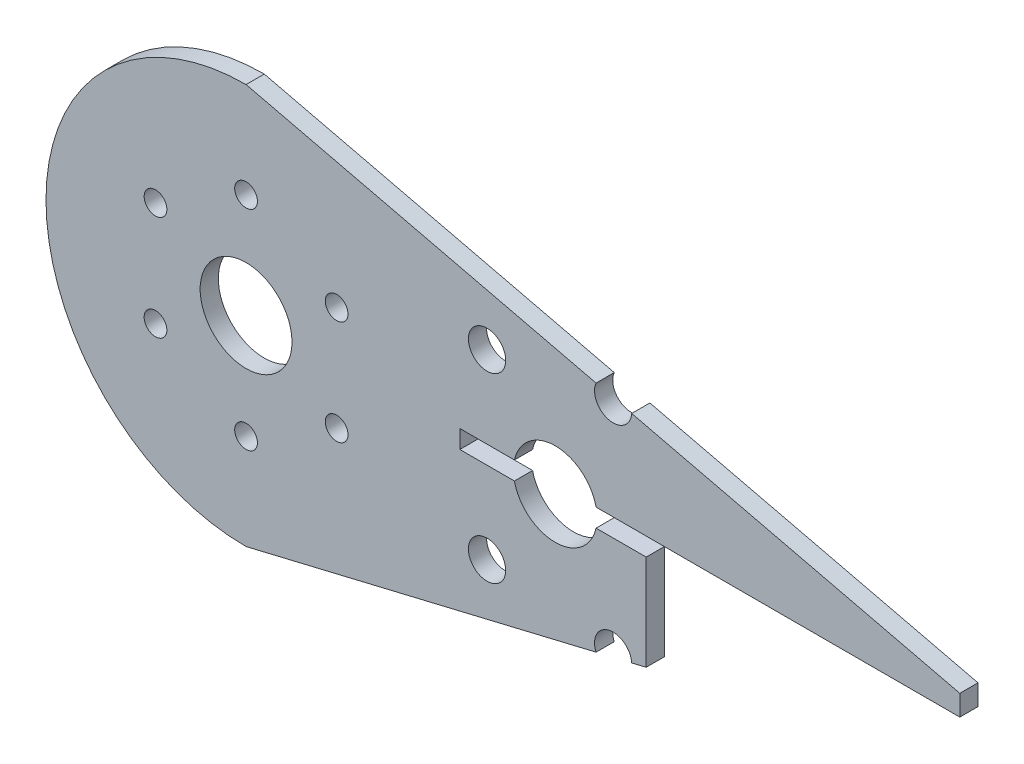
ISO-10303-21;
HEADER;
FILE_DESCRIPTION(('STEP AP214'),'2;1');
FILE_NAME('part.step','',(''),(''),'','','');
FILE_SCHEMA(('AUTOMOTIVE_DESIGN { 1 0 10303 214 1 1 1 1 }'));
ENDSEC;
DATA;
#1=APPLICATION_CONTEXT('core data for automotive mechanical design processes');
#2=APPLICATION_PROTOCOL_DEFINITION('international standard','automotive_design',2000,#1);
#3=PRODUCT_CONTEXT('',#1,'mechanical');
#4=PRODUCT('Part','Part','',(#3));
#5=PRODUCT_RELATED_PRODUCT_CATEGORY('part','',(#4));
#6=PRODUCT_DEFINITION_FORMATION('','',#4);
#7=PRODUCT_DEFINITION_CONTEXT('part definition',#1,'design');
#8=PRODUCT_DEFINITION('design','',#6,#7);
#9=PRODUCT_DEFINITION_SHAPE('','',#8);
#10=(LENGTH_UNIT() NAMED_UNIT(*) SI_UNIT(.MILLI.,.METRE.));
#11=(NAMED_UNIT(*) PLANE_ANGLE_UNIT() SI_UNIT($,.RADIAN.));
#12=(NAMED_UNIT(*) SI_UNIT($,.STERADIAN.) SOLID_ANGLE_UNIT());
#13=UNCERTAINTY_MEASURE_WITH_UNIT(LENGTH_MEASURE(1.E-05),#10,'distance_accuracy_value','');
#14=(GEOMETRIC_REPRESENTATION_CONTEXT(3) GLOBAL_UNCERTAINTY_ASSIGNED_CONTEXT((#13)) GLOBAL_UNIT_ASSIGNED_CONTEXT((#10,
#11,#12)) REPRESENTATION_CONTEXT('',''));
#15=CARTESIAN_POINT('',(0.,0.,0.));
#16=DIRECTION('',(0.,0.,1.));
#17=DIRECTION('',(1.,0.,0.));
#18=AXIS2_PLACEMENT_3D('',#15,#16,#17);
#19=CARTESIAN_POINT('',(-38.9989951683486,0.,2.));
#20=DIRECTION('',(0.,0.,1.));
#21=DIRECTION('',(1.,0.,0.));
#22=AXIS2_PLACEMENT_3D('',#19,#20,#21);
#23=PLANE('',#22);
#24=CARTESIAN_POINT('',(-29.0397030248275,5.7499999999999,2.));
#25=DIRECTION('',(0.,0.,1.));
#26=DIRECTION('',(1.,0.,0.));
#27=AXIS2_PLACEMENT_3D('',#24,#25,#26);
#28=CIRCLE('',#27,1.25);
#29=CARTESIAN_POINT('',(-27.7897030248275,5.7499999999999,2.));
#30=VERTEX_POINT('',#29);
#31=EDGE_CURVE('E368',#30,#30,#28,.T.);
#32=ORIENTED_EDGE('',*,*,#31,.F.);
#33=EDGE_LOOP('',(#32));
#34=FACE_BOUND('',#33,.T.);
#35=CARTESIAN_POINT('',(-12.4989951683486,-10.,2.));
#36=DIRECTION('',(0.,0.,1.));
#37=DIRECTION('',(1.,0.,0.));
#38=AXIS2_PLACEMENT_3D('',#35,#36,#37);
#39=CIRCLE('',#38,2.05);
#40=CARTESIAN_POINT('',(-10.4489951683486,-10.,2.));
#41=VERTEX_POINT('',#40);
#42=EDGE_CURVE('E380',#41,#41,#39,.T.);
#43=ORIENTED_EDGE('',*,*,#42,.F.);
#44=EDGE_LOOP('',(#43));
#45=FACE_BOUND('',#44,.T.);
#46=CARTESIAN_POINT('',(-38.9989951683486,0.,2.));
#47=DIRECTION('',(0.,0.,1.));
#48=DIRECTION('',(1.,0.,0.));
#49=AXIS2_PLACEMENT_3D('',#46,#47,#48);
#50=CIRCLE('',#49,5.05);
#51=CARTESIAN_POINT('',(-33.9489951683486,0.,2.));
#52=VERTEX_POINT('',#51);
#53=EDGE_CURVE('E392',#52,#52,#50,.T.);
#54=ORIENTED_EDGE('',*,*,#53,.F.);
#55=EDGE_LOOP('',(#54));
#56=FACE_BOUND('',#55,.T.);
#57=CARTESIAN_POINT('',(-12.4989951683486,10.,2.));
#58=DIRECTION('',(0.,0.,1.));
#59=DIRECTION('',(-1.,0.,0.));
#60=AXIS2_PLACEMENT_3D('',#57,#58,#59);
#61=CIRCLE('',#60,2.05);
#62=CARTESIAN_POINT('',(-14.5489951683486,10.,2.));
#63=VERTEX_POINT('',#62);
#64=EDGE_CURVE('E404',#63,#63,#61,.T.);
#65=ORIENTED_EDGE('',*,*,#64,.F.);
#66=EDGE_LOOP('',(#65));
#67=FACE_BOUND('',#66,.T.);
#68=CARTESIAN_POINT('',(-38.9989951683486,0.,2.));
#69=DIRECTION('',(0.,0.,1.));
#70=DIRECTION('',(1.,0.,0.));
#71=AXIS2_PLACEMENT_3D('',#68,#69,#70);
#72=CIRCLE('',#71,22.0020096633054);
#73=CARTESIAN_POINT('',(-38.9989951683486,22.0020096633054,2.));
#74=VERTEX_POINT('',#73);
#75=CARTESIAN_POINT('',(-38.9989951683486,-22.0020096633054,2.));
#76=VERTEX_POINT('',#75);
#77=EDGE_CURVE('E214',#74,#76,#72,.T.);
#78=ORIENTED_EDGE('',*,*,#77,.T.);
#79=DIRECTION('',(0.972682474371782,0.232139621887318,0.));
#80=VECTOR('',#79,1.);
#81=CARTESIAN_POINT('',(-38.9989951683486,-22.0020096633054,2.));
#82=LINE('',#81,#80);
#83=CARTESIAN_POINT('',(-0.509006304219854,-12.8160196852946,2.));
#84=VERTEX_POINT('',#83);
#85=EDGE_CURVE('E121',#76,#84,#82,.T.);
#86=ORIENTED_EDGE('',*,*,#85,.T.);
#87=CARTESIAN_POINT('',(1.367381780104,-12.0051485607125,2.));
#88=DIRECTION('',(0.,0.,-1.));
#89=DIRECTION('',(-1.,0.,0.));
#90=AXIS2_PLACEMENT_3D('',#87,#88,#89);
#91=CIRCLE('',#90,2.04409985658078);
#92=CARTESIAN_POINT('',(3.40772363119967,-11.8812560494737,2.));
#93=VERTEX_POINT('',#92);
#94=EDGE_CURVE('E253',#84,#93,#91,.T.);
#95=ORIENTED_EDGE('',*,*,#94,.T.);
#96=DIRECTION('',(0.972682474371784,0.232139621887311,0.));
#97=VECTOR('',#96,1.);
#98=CARTESIAN_POINT('',(3.40772363119967,-11.8812560494737,2.));
#99=LINE('',#98,#97);
#100=CARTESIAN_POINT('',(5.00100483165142,-11.5010048316527,2.));
#101=VERTEX_POINT('',#100);
#102=EDGE_CURVE('E272',#93,#101,#99,.T.);
#103=ORIENTED_EDGE('',*,*,#102,.T.);
#104=DIRECTION('',(0.,1.,0.));
#105=VECTOR('',#104,1.);
#106=CARTESIAN_POINT('',(5.00100483165142,-1.,2.));
#107=LINE('',#106,#105);
#108=CARTESIAN_POINT('',(5.00100483165142,-1.,2.));
#109=VERTEX_POINT('',#108);
#110=EDGE_CURVE('E269',#101,#109,#107,.T.);
#111=ORIENTED_EDGE('',*,*,#110,.T.);
#112=DIRECTION('',(-1.,0.,0.));
#113=VECTOR('',#112,1.);
#114=CARTESIAN_POINT('',(5.00100483165142,-1.,2.));
#115=LINE('',#114,#113);
#116=CARTESIAN_POINT('',(-0.509006304219855,-1.,2.));
#117=VERTEX_POINT('',#116);
#118=EDGE_CURVE('E271',#109,#117,#115,.T.);
#119=ORIENTED_EDGE('',*,*,#118,.T.);
#120=CARTESIAN_POINT('',(-4.99899516834858,0.,2.));
#121=DIRECTION('',(0.,0.,-1.));
#122=DIRECTION('',(-1.,0.,0.));
#123=AXIS2_PLACEMENT_3D('',#120,#121,#122);
#124=CIRCLE('',#123,4.6);
#125=CARTESIAN_POINT('',(-9.48898403247731,-1.,2.));
#126=VERTEX_POINT('',#125);
#127=EDGE_CURVE('E274',#117,#126,#124,.T.);
#128=ORIENTED_EDGE('',*,*,#127,.T.);
#129=DIRECTION('',(-1.,0.,0.));
#130=VECTOR('',#129,1.);
#131=CARTESIAN_POINT('',(-15.4889840324773,-1.,2.));
#132=LINE('',#131,#130);
#133=CARTESIAN_POINT('',(-15.4889840324773,-1.,2.));
#134=VERTEX_POINT('',#133);
#135=EDGE_CURVE('E280',#126,#134,#132,.T.);
#136=ORIENTED_EDGE('',*,*,#135,.T.);
#137=DIRECTION('',(0.,1.,0.));
#138=VECTOR('',#137,1.);
#139=CARTESIAN_POINT('',(-15.4889840324773,1.,2.));
#140=LINE('',#139,#138);
#141=CARTESIAN_POINT('',(-15.4889840324773,1.,2.));
#142=VERTEX_POINT('',#141);
#143=EDGE_CURVE('E282',#134,#142,#140,.T.);
#144=ORIENTED_EDGE('',*,*,#143,.T.);
#145=DIRECTION('',(1.,0.,0.));
#146=VECTOR('',#145,1.);
#147=CARTESIAN_POINT('',(-15.4889840324773,1.,2.));
#148=LINE('',#147,#146);
#149=CARTESIAN_POINT('',(-9.48898403247731,1.,2.));
#150=VERTEX_POINT('',#149);
#151=EDGE_CURVE('E284',#142,#150,#148,.T.);
#152=ORIENTED_EDGE('',*,*,#151,.T.);
#153=CARTESIAN_POINT('',(-4.99899516834858,0.,2.));
#154=DIRECTION('',(0.,0.,-1.));
#155=DIRECTION('',(1.,0.,0.));
#156=AXIS2_PLACEMENT_3D('',#153,#154,#155);
#157=CIRCLE('',#156,4.6);
#158=CARTESIAN_POINT('',(-0.509006304219855,1.,2.));
#159=VERTEX_POINT('',#158);
#160=EDGE_CURVE('E286',#150,#159,#157,.T.);
#161=ORIENTED_EDGE('',*,*,#160,.T.);
#162=DIRECTION('',(1.,0.,0.));
#163=VECTOR('',#162,1.);
#164=CARTESIAN_POINT('',(5.00100483165142,1.,2.));
#165=LINE('',#164,#163);
#166=CARTESIAN_POINT('',(39.4927398976703,1.,2.));
#167=VERTEX_POINT('',#166);
#168=EDGE_CURVE('E288',#159,#167,#165,.T.);
#169=ORIENTED_EDGE('',*,*,#168,.T.);
#170=DIRECTION('',(0.,1.,0.));
#171=VECTOR('',#170,1.);
#172=CARTESIAN_POINT('',(39.4927398976703,3.26923490937204,2.));
#173=LINE('',#172,#171);
#174=CARTESIAN_POINT('',(39.4927398976703,3.26923490937204,2.));
#175=VERTEX_POINT('',#174);
#176=EDGE_CURVE('E164',#167,#175,#173,.T.);
#177=ORIENTED_EDGE('',*,*,#176,.T.);
#178=DIRECTION('',(-0.972682474371782,0.232139621887318,0.));
#179=VECTOR('',#178,1.);
#180=CARTESIAN_POINT('',(5.00100483165142,11.5010048316527,2.));
#181=LINE('',#180,#179);
#182=CARTESIAN_POINT('',(3.40772363119967,11.8812560494737,2.));
#183=VERTEX_POINT('',#182);
#184=EDGE_CURVE('E158',#175,#183,#181,.T.);
#185=ORIENTED_EDGE('',*,*,#184,.T.);
#186=CARTESIAN_POINT('',(1.367381780104,12.0051485607125,2.));
#187=DIRECTION('',(0.,0.,-1.));
#188=DIRECTION('',(1.,0.,0.));
#189=AXIS2_PLACEMENT_3D('',#186,#187,#188);
#190=CIRCLE('',#189,2.04409985658078);
#191=CARTESIAN_POINT('',(-0.509006304219855,12.8160196852946,2.));
#192=VERTEX_POINT('',#191);
#193=EDGE_CURVE('E162',#183,#192,#190,.T.);
#194=ORIENTED_EDGE('',*,*,#193,.T.);
#195=DIRECTION('',(-0.972682474371782,0.232139621887318,0.));
#196=VECTOR('',#195,1.);
#197=CARTESIAN_POINT('',(-38.9989951683486,22.0020096633054,2.));
#198=LINE('',#197,#196);
#199=EDGE_CURVE('E54',#192,#74,#198,.T.);
#200=ORIENTED_EDGE('',*,*,#199,.T.);
#201=EDGE_LOOP('',(#78,#86,#95,#103,#111,#119,#128,#136,#144,#152,#161,#169,#177,#185,#194,#200));
#202=FACE_BOUND('',#201,.T.);
#203=CARTESIAN_POINT('',(-48.9582873118697,-5.74999999999985,2.));
#204=DIRECTION('',(0.,0.,1.));
#205=DIRECTION('',(1.,0.,0.));
#206=AXIS2_PLACEMENT_3D('',#203,#204,#205);
#207=CIRCLE('',#206,1.25);
#208=CARTESIAN_POINT('',(-47.7082873118697,-5.74999999999985,2.));
#209=VERTEX_POINT('',#208);
#210=EDGE_CURVE('E185',#209,#209,#207,.T.);
#211=ORIENTED_EDGE('',*,*,#210,.F.);
#212=EDGE_LOOP('',(#211));
#213=FACE_BOUND('',#212,.T.);
#214=CARTESIAN_POINT('',(-48.9582873118696,5.75000000000005,2.));
#215=DIRECTION('',(0.,0.,1.));
#216=DIRECTION('',(1.,0.,0.));
#217=AXIS2_PLACEMENT_3D('',#214,#215,#216);
#218=CIRCLE('',#217,1.25);
#219=CARTESIAN_POINT('',(-47.7082873118696,5.75000000000005,2.));
#220=VERTEX_POINT('',#219);
#221=EDGE_CURVE('E398',#220,#220,#218,.T.);
#222=ORIENTED_EDGE('',*,*,#221,.F.);
#223=EDGE_LOOP('',(#222));
#224=FACE_BOUND('',#223,.T.);
#225=CARTESIAN_POINT('',(-38.9989951683486,-11.5,2.));
#226=DIRECTION('',(0.,0.,1.));
#227=DIRECTION('',(1.,0.,0.));
#228=AXIS2_PLACEMENT_3D('',#225,#226,#227);
#229=CIRCLE('',#228,1.25);
#230=CARTESIAN_POINT('',(-37.7489951683486,-11.5,2.));
#231=VERTEX_POINT('',#230);
#232=EDGE_CURVE('E386',#231,#231,#229,.T.);
#233=ORIENTED_EDGE('',*,*,#232,.F.);
#234=EDGE_LOOP('',(#233));
#235=FACE_BOUND('',#234,.T.);
#236=CARTESIAN_POINT('',(-38.9989951683485,11.5,2.));
#237=DIRECTION('',(0.,0.,1.));
#238=DIRECTION('',(1.,0.,0.));
#239=AXIS2_PLACEMENT_3D('',#236,#237,#238);
#240=CIRCLE('',#239,1.25);
#241=CARTESIAN_POINT('',(-37.7489951683485,11.5,2.));
#242=VERTEX_POINT('',#241);
#243=EDGE_CURVE('E374',#242,#242,#240,.T.);
#244=ORIENTED_EDGE('',*,*,#243,.F.);
#245=EDGE_LOOP('',(#244));
#246=FACE_BOUND('',#245,.T.);
#247=CARTESIAN_POINT('',(-29.0397030248276,-5.75000000000012,2.));
#248=DIRECTION('',(0.,0.,1.));
#249=DIRECTION('',(1.,0.,0.));
#250=AXIS2_PLACEMENT_3D('',#247,#248,#249);
#251=CIRCLE('',#250,1.25);
#252=CARTESIAN_POINT('',(-27.7897030248276,-5.75000000000012,2.));
#253=VERTEX_POINT('',#252);
#254=EDGE_CURVE('E359',#253,#253,#251,.T.);
#255=ORIENTED_EDGE('',*,*,#254,.F.);
#256=EDGE_LOOP('',(#255));
#257=FACE_BOUND('',#256,.T.);
#258=ADVANCED_FACE('F37',(#34,#45,#56,#67,#202,#213,#224,#235,#246,#257),#23,.T.);
#259=CARTESIAN_POINT('',(-38.9989951683486,0.,0.));
#260=DIRECTION('',(0.,0.,1.));
#261=DIRECTION('',(1.,0.,0.));
#262=AXIS2_PLACEMENT_3D('',#259,#260,#261);
#263=PLANE('',#262);
#264=CARTESIAN_POINT('',(-38.9989951683486,0.,0.));
#265=DIRECTION('',(0.,0.,1.));
#266=DIRECTION('',(1.,0.,0.));
#267=AXIS2_PLACEMENT_3D('',#264,#265,#266);
#268=CIRCLE('',#267,22.0020096633054);
#269=CARTESIAN_POINT('',(-38.9989951683486,22.0020096633054,0.));
#270=VERTEX_POINT('',#269);
#271=CARTESIAN_POINT('',(-38.9989951683486,-22.0020096633054,0.));
#272=VERTEX_POINT('',#271);
#273=EDGE_CURVE('E181',#270,#272,#268,.T.);
#274=ORIENTED_EDGE('',*,*,#273,.F.);
#275=DIRECTION('',(-0.972682474371782,0.232139621887318,0.));
#276=VECTOR('',#275,1.);
#277=CARTESIAN_POINT('',(-38.9989951683486,22.0020096633054,0.));
#278=LINE('',#277,#276);
#279=CARTESIAN_POINT('',(-0.509006304219855,12.8160196852946,0.));
#280=VERTEX_POINT('',#279);
#281=EDGE_CURVE('E113',#280,#270,#278,.T.);
#282=ORIENTED_EDGE('',*,*,#281,.F.);
#283=CARTESIAN_POINT('',(1.367381780104,12.0051485607125,0.));
#284=DIRECTION('',(0.,0.,-1.));
#285=DIRECTION('',(1.,0.,0.));
#286=AXIS2_PLACEMENT_3D('',#283,#284,#285);
#287=CIRCLE('',#286,2.04409985658078);
#288=CARTESIAN_POINT('',(3.40772363119967,11.8812560494737,0.));
#289=VERTEX_POINT('',#288);
#290=EDGE_CURVE('E107',#289,#280,#287,.T.);
#291=ORIENTED_EDGE('',*,*,#290,.F.);
#292=DIRECTION('',(-0.972682474371782,0.232139621887318,0.));
#293=VECTOR('',#292,1.);
#294=CARTESIAN_POINT('',(3.40772363119967,11.8812560494737,0.));
#295=LINE('',#294,#293);
#296=CARTESIAN_POINT('',(39.4927398976703,3.26923490937204,0.));
#297=VERTEX_POINT('',#296);
#298=EDGE_CURVE('E171',#297,#289,#295,.T.);
#299=ORIENTED_EDGE('',*,*,#298,.F.);
#300=DIRECTION('',(0.,1.,0.));
#301=VECTOR('',#300,1.);
#302=CARTESIAN_POINT('',(39.4927398976703,3.26923490937204,0.));
#303=LINE('',#302,#301);
#304=CARTESIAN_POINT('',(39.4927398976703,1.,0.));
#305=VERTEX_POINT('',#304);
#306=EDGE_CURVE('E208',#305,#297,#303,.T.);
#307=ORIENTED_EDGE('',*,*,#306,.F.);
#308=DIRECTION('',(1.,0.,0.));
#309=VECTOR('',#308,1.);
#310=CARTESIAN_POINT('',(5.00100483165142,1.,0.));
#311=LINE('',#310,#309);
#312=CARTESIAN_POINT('',(-0.509006304219855,1.,0.));
#313=VERTEX_POINT('',#312);
#314=EDGE_CURVE('E206',#313,#305,#311,.T.);
#315=ORIENTED_EDGE('',*,*,#314,.F.);
#316=CARTESIAN_POINT('',(-4.99899516834858,0.,0.));
#317=DIRECTION('',(0.,0.,-1.));
#318=DIRECTION('',(1.,0.,0.));
#319=AXIS2_PLACEMENT_3D('',#316,#317,#318);
#320=CIRCLE('',#319,4.6);
#321=CARTESIAN_POINT('',(-9.48898403247731,1.,0.));
#322=VERTEX_POINT('',#321);
#323=EDGE_CURVE('E203',#322,#313,#320,.T.);
#324=ORIENTED_EDGE('',*,*,#323,.F.);
#325=DIRECTION('',(1.,0.,0.));
#326=VECTOR('',#325,1.);
#327=CARTESIAN_POINT('',(-15.4889840324773,1.,0.));
#328=LINE('',#327,#326);
#329=CARTESIAN_POINT('',(-15.4889840324773,1.,0.));
#330=VERTEX_POINT('',#329);
#331=EDGE_CURVE('E201',#330,#322,#328,.T.);
#332=ORIENTED_EDGE('',*,*,#331,.F.);
#333=DIRECTION('',(0.,1.,0.));
#334=VECTOR('',#333,1.);
#335=CARTESIAN_POINT('',(-15.4889840324773,1.,0.));
#336=LINE('',#335,#334);
#337=CARTESIAN_POINT('',(-15.4889840324773,-1.,0.));
#338=VERTEX_POINT('',#337);
#339=EDGE_CURVE('E199',#338,#330,#336,.T.);
#340=ORIENTED_EDGE('',*,*,#339,.F.);
#341=DIRECTION('',(-1.,0.,0.));
#342=VECTOR('',#341,1.);
#343=CARTESIAN_POINT('',(-15.4889840324773,-1.,0.));
#344=LINE('',#343,#342);
#345=CARTESIAN_POINT('',(-9.48898403247731,-1.,0.));
#346=VERTEX_POINT('',#345);
#347=EDGE_CURVE('E197',#346,#338,#344,.T.);
#348=ORIENTED_EDGE('',*,*,#347,.F.);
#349=CARTESIAN_POINT('',(-4.99899516834858,0.,0.));
#350=DIRECTION('',(0.,0.,-1.));
#351=DIRECTION('',(-1.,0.,0.));
#352=AXIS2_PLACEMENT_3D('',#349,#350,#351);
#353=CIRCLE('',#352,4.6);
#354=CARTESIAN_POINT('',(-0.509006304219855,-1.,0.));
#355=VERTEX_POINT('',#354);
#356=EDGE_CURVE('E195',#355,#346,#353,.T.);
#357=ORIENTED_EDGE('',*,*,#356,.F.);
#358=DIRECTION('',(-1.,0.,0.));
#359=VECTOR('',#358,1.);
#360=CARTESIAN_POINT('',(5.00100483165142,-1.,0.));
#361=LINE('',#360,#359);
#362=CARTESIAN_POINT('',(5.00100483165142,-1.,0.));
#363=VERTEX_POINT('',#362);
#364=EDGE_CURVE('E193',#363,#355,#361,.T.);
#365=ORIENTED_EDGE('',*,*,#364,.F.);
#366=DIRECTION('',(0.,1.,0.));
#367=VECTOR('',#366,1.);
#368=CARTESIAN_POINT('',(5.00100483165142,-1.,0.));
#369=LINE('',#368,#367);
#370=CARTESIAN_POINT('',(5.00100483165142,-11.5010048316527,0.));
#371=VERTEX_POINT('',#370);
#372=EDGE_CURVE('E191',#371,#363,#369,.T.);
#373=ORIENTED_EDGE('',*,*,#372,.F.);
#374=DIRECTION('',(0.972682474371784,0.232139621887311,0.));
#375=VECTOR('',#374,1.);
#376=CARTESIAN_POINT('',(3.40772363119967,-11.8812560494737,0.));
#377=LINE('',#376,#375);
#378=CARTESIAN_POINT('',(3.40772363119967,-11.8812560494737,0.));
#379=VERTEX_POINT('',#378);
#380=EDGE_CURVE('E189',#379,#371,#377,.T.);
#381=ORIENTED_EDGE('',*,*,#380,.F.);
#382=CARTESIAN_POINT('',(1.367381780104,-12.0051485607125,0.));
#383=DIRECTION('',(0.,0.,-1.));
#384=DIRECTION('',(-1.,0.,0.));
#385=AXIS2_PLACEMENT_3D('',#382,#383,#384);
#386=CIRCLE('',#385,2.04409985658078);
#387=CARTESIAN_POINT('',(-0.509006304219854,-12.8160196852946,0.));
#388=VERTEX_POINT('',#387);
#389=EDGE_CURVE('E187',#388,#379,#386,.T.);
#390=ORIENTED_EDGE('',*,*,#389,.F.);
#391=DIRECTION('',(0.972682474371782,0.232139621887318,0.));
#392=VECTOR('',#391,1.);
#393=CARTESIAN_POINT('',(-38.9989951683486,-22.0020096633054,0.));
#394=LINE('',#393,#392);
#395=EDGE_CURVE('E184',#272,#388,#394,.T.);
#396=ORIENTED_EDGE('',*,*,#395,.F.);
#397=EDGE_LOOP('',(#274,#282,#291,#299,#307,#315,#324,#332,#340,#348,#357,#365,#373,#381,#390,#396));
#398=FACE_BOUND('',#397,.T.);
#399=CARTESIAN_POINT('',(-48.9582873118697,-5.74999999999985,0.));
#400=DIRECTION('',(0.,0.,1.));
#401=DIRECTION('',(1.,0.,0.));
#402=AXIS2_PLACEMENT_3D('',#399,#400,#401);
#403=CIRCLE('',#402,1.25);
#404=CARTESIAN_POINT('',(-47.7082873118697,-5.74999999999985,0.));
#405=VERTEX_POINT('',#404);
#406=EDGE_CURVE('E407',#405,#405,#403,.T.);
#407=ORIENTED_EDGE('',*,*,#406,.T.);
#408=EDGE_LOOP('',(#407));
#409=FACE_BOUND('',#408,.T.);
#410=CARTESIAN_POINT('',(-12.4989951683486,10.,0.));
#411=DIRECTION('',(0.,0.,1.));
#412=DIRECTION('',(-1.,0.,0.));
#413=AXIS2_PLACEMENT_3D('',#410,#411,#412);
#414=CIRCLE('',#413,2.05);
#415=CARTESIAN_POINT('',(-14.5489951683486,10.,0.));
#416=VERTEX_POINT('',#415);
#417=EDGE_CURVE('E401',#416,#416,#414,.T.);
#418=ORIENTED_EDGE('',*,*,#417,.T.);
#419=EDGE_LOOP('',(#418));
#420=FACE_BOUND('',#419,.T.);
#421=CARTESIAN_POINT('',(-48.9582873118696,5.75000000000005,0.));
#422=DIRECTION('',(0.,0.,1.));
#423=DIRECTION('',(1.,0.,0.));
#424=AXIS2_PLACEMENT_3D('',#421,#422,#423);
#425=CIRCLE('',#424,1.25);
#426=CARTESIAN_POINT('',(-47.7082873118696,5.75000000000005,0.));
#427=VERTEX_POINT('',#426);
#428=EDGE_CURVE('E395',#427,#427,#425,.T.);
#429=ORIENTED_EDGE('',*,*,#428,.T.);
#430=EDGE_LOOP('',(#429));
#431=FACE_BOUND('',#430,.T.);
#432=CARTESIAN_POINT('',(-38.9989951683486,0.,0.));
#433=DIRECTION('',(0.,0.,1.));
#434=DIRECTION('',(1.,0.,0.));
#435=AXIS2_PLACEMENT_3D('',#432,#433,#434);
#436=CIRCLE('',#435,5.05);
#437=CARTESIAN_POINT('',(-33.9489951683486,0.,0.));
#438=VERTEX_POINT('',#437);
#439=EDGE_CURVE('E389',#438,#438,#436,.T.);
#440=ORIENTED_EDGE('',*,*,#439,.T.);
#441=EDGE_LOOP('',(#440));
#442=FACE_BOUND('',#441,.T.);
#443=CARTESIAN_POINT('',(-38.9989951683486,-11.5,0.));
#444=DIRECTION('',(0.,0.,1.));
#445=DIRECTION('',(1.,0.,0.));
#446=AXIS2_PLACEMENT_3D('',#443,#444,#445);
#447=CIRCLE('',#446,1.25);
#448=CARTESIAN_POINT('',(-37.7489951683486,-11.5,0.));
#449=VERTEX_POINT('',#448);
#450=EDGE_CURVE('E383',#449,#449,#447,.T.);
#451=ORIENTED_EDGE('',*,*,#450,.T.);
#452=EDGE_LOOP('',(#451));
#453=FACE_BOUND('',#452,.T.);
#454=CARTESIAN_POINT('',(-12.4989951683486,-10.,0.));
#455=DIRECTION('',(0.,0.,1.));
#456=DIRECTION('',(1.,0.,0.));
#457=AXIS2_PLACEMENT_3D('',#454,#455,#456);
#458=CIRCLE('',#457,2.05);
#459=CARTESIAN_POINT('',(-10.4489951683486,-10.,0.));
#460=VERTEX_POINT('',#459);
#461=EDGE_CURVE('E377',#460,#460,#458,.T.);
#462=ORIENTED_EDGE('',*,*,#461,.T.);
#463=EDGE_LOOP('',(#462));
#464=FACE_BOUND('',#463,.T.);
#465=CARTESIAN_POINT('',(-38.9989951683485,11.5,0.));
#466=DIRECTION('',(0.,0.,1.));
#467=DIRECTION('',(1.,0.,0.));
#468=AXIS2_PLACEMENT_3D('',#465,#466,#467);
#469=CIRCLE('',#468,1.25);
#470=CARTESIAN_POINT('',(-37.7489951683485,11.5,0.));
#471=VERTEX_POINT('',#470);
#472=EDGE_CURVE('E371',#471,#471,#469,.T.);
#473=ORIENTED_EDGE('',*,*,#472,.T.);
#474=EDGE_LOOP('',(#473));
#475=FACE_BOUND('',#474,.T.);
#476=CARTESIAN_POINT('',(-29.0397030248275,5.7499999999999,0.));
#477=DIRECTION('',(0.,0.,1.));
#478=DIRECTION('',(1.,0.,0.));
#479=AXIS2_PLACEMENT_3D('',#476,#477,#478);
#480=CIRCLE('',#479,1.25);
#481=CARTESIAN_POINT('',(-27.7897030248275,5.7499999999999,0.));
#482=VERTEX_POINT('',#481);
#483=EDGE_CURVE('E365',#482,#482,#480,.T.);
#484=ORIENTED_EDGE('',*,*,#483,.T.);
#485=EDGE_LOOP('',(#484));
#486=FACE_BOUND('',#485,.T.);
#487=CARTESIAN_POINT('',(-29.0397030248276,-5.75000000000012,0.));
#488=DIRECTION('',(0.,0.,1.));
#489=DIRECTION('',(1.,0.,0.));
#490=AXIS2_PLACEMENT_3D('',#487,#488,#489);
#491=CIRCLE('',#490,1.25);
#492=CARTESIAN_POINT('',(-27.7897030248276,-5.75000000000012,0.));
#493=VERTEX_POINT('',#492);
#494=EDGE_CURVE('E362',#493,#493,#491,.T.);
#495=ORIENTED_EDGE('',*,*,#494,.T.);
#496=EDGE_LOOP('',(#495));
#497=FACE_BOUND('',#496,.T.);
#498=ADVANCED_FACE('F257',(#398,#409,#420,#431,#442,#453,#464,#475,#486,#497),#263,.F.);
#499=CARTESIAN_POINT('',(-38.9989951683486,0.,2.));
#500=DIRECTION('',(0.,0.,-1.));
#501=DIRECTION('',(-1.,0.,0.));
#502=AXIS2_PLACEMENT_3D('',#499,#500,#501);
#503=CYLINDRICAL_SURFACE('',#502,22.0020096633054);
#504=ORIENTED_EDGE('',*,*,#273,.T.);
#505=DIRECTION('',(0.,0.,-1.));
#506=VECTOR('',#505,1.);
#507=CARTESIAN_POINT('',(-38.9989951683486,-22.0020096633054,2.));
#508=LINE('',#507,#506);
#509=EDGE_CURVE('E11',#76,#272,#508,.T.);
#510=ORIENTED_EDGE('',*,*,#509,.F.);
#511=ORIENTED_EDGE('',*,*,#77,.F.);
#512=DIRECTION('',(0.,0.,-1.));
#513=VECTOR('',#512,1.);
#514=CARTESIAN_POINT('',(-38.9989951683486,22.0020096633054,2.));
#515=LINE('',#514,#513);
#516=EDGE_CURVE('E177',#74,#270,#515,.T.);
#517=ORIENTED_EDGE('',*,*,#516,.T.);
#518=EDGE_LOOP('',(#504,#510,#511,#517));
#519=FACE_BOUND('',#518,.T.);
#520=ADVANCED_FACE('F39',(#519),#503,.T.);
#521=CARTESIAN_POINT('',(-38.9989951683486,-22.0020096633054,2.));
#522=DIRECTION('',(-0.232139621887318,0.972682474371782,0.));
#523=DIRECTION('',(-0.972682474371782,-0.232139621887318,0.));
#524=AXIS2_PLACEMENT_3D('',#521,#522,#523);
#525=PLANE('',#524);
#526=ORIENTED_EDGE('',*,*,#395,.T.);
#527=DIRECTION('',(0.,0.,-1.));
#528=VECTOR('',#527,1.);
#529=CARTESIAN_POINT('',(-0.509006304219854,-12.8160196852946,2.));
#530=LINE('',#529,#528);
#531=EDGE_CURVE('E46',#84,#388,#530,.T.);
#532=ORIENTED_EDGE('',*,*,#531,.F.);
#533=ORIENTED_EDGE('',*,*,#85,.F.);
#534=ORIENTED_EDGE('',*,*,#509,.T.);
#535=EDGE_LOOP('',(#526,#532,#533,#534));
#536=FACE_BOUND('',#535,.T.);
#537=ADVANCED_FACE('F604',(#536),#525,.F.);
#538=CARTESIAN_POINT('',(1.367381780104,-12.0051485607125,2.));
#539=DIRECTION('',(0.,0.,-1.));
#540=DIRECTION('',(-1.,0.,0.));
#541=AXIS2_PLACEMENT_3D('',#538,#539,#540);
#542=CYLINDRICAL_SURFACE('',#541,2.04409985658078);
#543=ORIENTED_EDGE('',*,*,#389,.T.);
#544=DIRECTION('',(0.,0.,-1.));
#545=VECTOR('',#544,1.);
#546=CARTESIAN_POINT('',(3.40772363119967,-11.8812560494737,2.));
#547=LINE('',#546,#545);
#548=EDGE_CURVE('E245',#93,#379,#547,.T.);
#549=ORIENTED_EDGE('',*,*,#548,.F.);
#550=ORIENTED_EDGE('',*,*,#94,.F.);
#551=ORIENTED_EDGE('',*,*,#531,.T.);
#552=EDGE_LOOP('',(#543,#549,#550,#551));
#553=FACE_BOUND('',#552,.T.);
#554=ADVANCED_FACE('F251',(#553),#542,.F.);
#555=CARTESIAN_POINT('',(3.40772363119967,-11.8812560494737,2.));
#556=DIRECTION('',(-0.232139621887311,0.972682474371784,0.));
#557=DIRECTION('',(-0.972682474371784,-0.232139621887311,0.));
#558=AXIS2_PLACEMENT_3D('',#555,#556,#557);
#559=PLANE('',#558);
#560=ORIENTED_EDGE('',*,*,#380,.T.);
#561=DIRECTION('',(0.,0.,-1.));
#562=VECTOR('',#561,1.);
#563=CARTESIAN_POINT('',(5.00100483165142,-11.5010048316527,2.));
#564=LINE('',#563,#562);
#565=EDGE_CURVE('E242',#101,#371,#564,.T.);
#566=ORIENTED_EDGE('',*,*,#565,.F.);
#567=ORIENTED_EDGE('',*,*,#102,.F.);
#568=ORIENTED_EDGE('',*,*,#548,.T.);
#569=EDGE_LOOP('',(#560,#566,#567,#568));
#570=FACE_BOUND('',#569,.T.);
#571=ADVANCED_FACE('F263',(#570),#559,.F.);
#572=CARTESIAN_POINT('',(5.00100483165142,-1.,2.));
#573=DIRECTION('',(-1.,0.,0.));
#574=DIRECTION('',(0.,0.,1.));
#575=AXIS2_PLACEMENT_3D('',#572,#573,#574);
#576=PLANE('',#575);
#577=ORIENTED_EDGE('',*,*,#372,.T.);
#578=DIRECTION('',(0.,0.,-1.));
#579=VECTOR('',#578,1.);
#580=CARTESIAN_POINT('',(5.00100483165142,-1.,2.));
#581=LINE('',#580,#579);
#582=EDGE_CURVE('E239',#109,#363,#581,.T.);
#583=ORIENTED_EDGE('',*,*,#582,.F.);
#584=ORIENTED_EDGE('',*,*,#110,.F.);
#585=ORIENTED_EDGE('',*,*,#565,.T.);
#586=EDGE_LOOP('',(#577,#583,#584,#585));
#587=FACE_BOUND('',#586,.T.);
#588=ADVANCED_FACE('F267',(#587),#576,.F.);
#589=CARTESIAN_POINT('',(5.00100483165142,-1.,2.));
#590=DIRECTION('',(0.,-1.,0.));
#591=DIRECTION('',(0.,0.,-1.));
#592=AXIS2_PLACEMENT_3D('',#589,#590,#591);
#593=PLANE('',#592);
#594=ORIENTED_EDGE('',*,*,#364,.T.);
#595=DIRECTION('',(0.,0.,-1.));
#596=VECTOR('',#595,1.);
#597=CARTESIAN_POINT('',(-0.509006304219855,-1.,2.));
#598=LINE('',#597,#596);
#599=EDGE_CURVE('E236',#117,#355,#598,.T.);
#600=ORIENTED_EDGE('',*,*,#599,.F.);
#601=ORIENTED_EDGE('',*,*,#118,.F.);
#602=ORIENTED_EDGE('',*,*,#582,.T.);
#603=EDGE_LOOP('',(#594,#600,#601,#602));
#604=FACE_BOUND('',#603,.T.);
#605=ADVANCED_FACE('F569',(#604),#593,.F.);
#606=CARTESIAN_POINT('',(-4.99899516834858,0.,2.));
#607=DIRECTION('',(0.,0.,-1.));
#608=DIRECTION('',(-1.,0.,0.));
#609=AXIS2_PLACEMENT_3D('',#606,#607,#608);
#610=CYLINDRICAL_SURFACE('',#609,4.6);
#611=ORIENTED_EDGE('',*,*,#356,.T.);
#612=DIRECTION('',(0.,0.,-1.));
#613=VECTOR('',#612,1.);
#614=CARTESIAN_POINT('',(-9.48898403247731,-1.,2.));
#615=LINE('',#614,#613);
#616=EDGE_CURVE('E233',#126,#346,#615,.T.);
#617=ORIENTED_EDGE('',*,*,#616,.F.);
#618=ORIENTED_EDGE('',*,*,#127,.F.);
#619=ORIENTED_EDGE('',*,*,#599,.T.);
#620=EDGE_LOOP('',(#611,#617,#618,#619));
#621=FACE_BOUND('',#620,.T.);
#622=ADVANCED_FACE('F559',(#621),#610,.F.);
#623=CARTESIAN_POINT('',(-15.4889840324773,-1.,2.));
#624=DIRECTION('',(0.,-1.,0.));
#625=DIRECTION('',(0.,0.,-1.));
#626=AXIS2_PLACEMENT_3D('',#623,#624,#625);
#627=PLANE('',#626);
#628=ORIENTED_EDGE('',*,*,#347,.T.);
#629=DIRECTION('',(0.,0.,-1.));
#630=VECTOR('',#629,1.);
#631=CARTESIAN_POINT('',(-15.4889840324773,-1.,2.));
#632=LINE('',#631,#630);
#633=EDGE_CURVE('E230',#134,#338,#632,.T.);
#634=ORIENTED_EDGE('',*,*,#633,.F.);
#635=ORIENTED_EDGE('',*,*,#135,.F.);
#636=ORIENTED_EDGE('',*,*,#616,.T.);
#637=EDGE_LOOP('',(#628,#634,#635,#636));
#638=FACE_BOUND('',#637,.T.);
#639=ADVANCED_FACE('F549',(#638),#627,.F.);
#640=CARTESIAN_POINT('',(-15.4889840324773,1.,2.));
#641=DIRECTION('',(-1.,0.,0.));
#642=DIRECTION('',(0.,0.,1.));
#643=AXIS2_PLACEMENT_3D('',#640,#641,#642);
#644=PLANE('',#643);
#645=ORIENTED_EDGE('',*,*,#339,.T.);
#646=DIRECTION('',(0.,0.,-1.));
#647=VECTOR('',#646,1.);
#648=CARTESIAN_POINT('',(-15.4889840324773,1.,2.));
#649=LINE('',#648,#647);
#650=EDGE_CURVE('E227',#142,#330,#649,.T.);
#651=ORIENTED_EDGE('',*,*,#650,.F.);
#652=ORIENTED_EDGE('',*,*,#143,.F.);
#653=ORIENTED_EDGE('',*,*,#633,.T.);
#654=EDGE_LOOP('',(#645,#651,#652,#653));
#655=FACE_BOUND('',#654,.T.);
#656=ADVANCED_FACE('F539',(#655),#644,.F.);
#657=CARTESIAN_POINT('',(-15.4889840324773,1.,2.));
#658=DIRECTION('',(0.,1.,0.));
#659=DIRECTION('',(0.,0.,1.));
#660=AXIS2_PLACEMENT_3D('',#657,#658,#659);
#661=PLANE('',#660);
#662=ORIENTED_EDGE('',*,*,#331,.T.);
#663=DIRECTION('',(0.,0.,-1.));
#664=VECTOR('',#663,1.);
#665=CARTESIAN_POINT('',(-9.48898403247731,1.,2.));
#666=LINE('',#665,#664);
#667=EDGE_CURVE('E224',#150,#322,#666,.T.);
#668=ORIENTED_EDGE('',*,*,#667,.F.);
#669=ORIENTED_EDGE('',*,*,#151,.F.);
#670=ORIENTED_EDGE('',*,*,#650,.T.);
#671=EDGE_LOOP('',(#662,#668,#669,#670));
#672=FACE_BOUND('',#671,.T.);
#673=ADVANCED_FACE('F529',(#672),#661,.F.);
#674=CARTESIAN_POINT('',(-4.99899516834858,0.,2.));
#675=DIRECTION('',(0.,0.,-1.));
#676=DIRECTION('',(-1.,0.,0.));
#677=AXIS2_PLACEMENT_3D('',#674,#675,#676);
#678=CYLINDRICAL_SURFACE('',#677,4.6);
#679=ORIENTED_EDGE('',*,*,#323,.T.);
#680=DIRECTION('',(0.,0.,-1.));
#681=VECTOR('',#680,1.);
#682=CARTESIAN_POINT('',(-0.509006304219855,1.,2.));
#683=LINE('',#682,#681);
#684=EDGE_CURVE('E221',#159,#313,#683,.T.);
#685=ORIENTED_EDGE('',*,*,#684,.F.);
#686=ORIENTED_EDGE('',*,*,#160,.F.);
#687=ORIENTED_EDGE('',*,*,#667,.T.);
#688=EDGE_LOOP('',(#679,#685,#686,#687));
#689=FACE_BOUND('',#688,.T.);
#690=ADVANCED_FACE('F519',(#689),#678,.F.);
#691=CARTESIAN_POINT('',(5.00100483165142,1.,2.));
#692=DIRECTION('',(0.,1.,0.));
#693=DIRECTION('',(0.,0.,1.));
#694=AXIS2_PLACEMENT_3D('',#691,#692,#693);
#695=PLANE('',#694);
#696=ORIENTED_EDGE('',*,*,#314,.T.);
#697=DIRECTION('',(0.,0.,-1.));
#698=VECTOR('',#697,1.);
#699=CARTESIAN_POINT('',(39.4927398976703,1.,2.));
#700=LINE('',#699,#698);
#701=EDGE_CURVE('E218',#167,#305,#700,.T.);
#702=ORIENTED_EDGE('',*,*,#701,.F.);
#703=ORIENTED_EDGE('',*,*,#168,.F.);
#704=ORIENTED_EDGE('',*,*,#684,.T.);
#705=EDGE_LOOP('',(#696,#702,#703,#704));
#706=FACE_BOUND('',#705,.T.);
#707=ADVANCED_FACE('F294',(#706),#695,.F.);
#708=CARTESIAN_POINT('',(39.4927398976703,3.26923490937204,2.));
#709=DIRECTION('',(-1.,0.,0.));
#710=DIRECTION('',(0.,0.,1.));
#711=AXIS2_PLACEMENT_3D('',#708,#709,#710);
#712=PLANE('',#711);
#713=ORIENTED_EDGE('',*,*,#306,.T.);
#714=DIRECTION('',(0.,0.,-1.));
#715=VECTOR('',#714,1.);
#716=CARTESIAN_POINT('',(39.4927398976703,3.26923490937204,2.));
#717=LINE('',#716,#715);
#718=EDGE_CURVE('E172',#175,#297,#717,.T.);
#719=ORIENTED_EDGE('',*,*,#718,.F.);
#720=ORIENTED_EDGE('',*,*,#176,.F.);
#721=ORIENTED_EDGE('',*,*,#701,.T.);
#722=EDGE_LOOP('',(#713,#719,#720,#721));
#723=FACE_BOUND('',#722,.T.);
#724=ADVANCED_FACE('F297',(#723),#712,.F.);
#725=CARTESIAN_POINT('',(3.40772363119967,11.8812560494737,2.));
#726=DIRECTION('',(-0.232139621887318,-0.972682474371782,0.));
#727=DIRECTION('',(0.972682474371782,-0.232139621887318,0.));
#728=AXIS2_PLACEMENT_3D('',#725,#726,#727);
#729=PLANE('',#728);
#730=ORIENTED_EDGE('',*,*,#298,.T.);
#731=DIRECTION('',(0.,0.,-1.));
#732=VECTOR('',#731,1.);
#733=CARTESIAN_POINT('',(3.40772363119967,11.8812560494737,2.));
#734=LINE('',#733,#732);
#735=EDGE_CURVE('E169',#183,#289,#734,.T.);
#736=ORIENTED_EDGE('',*,*,#735,.F.);
#737=ORIENTED_EDGE('',*,*,#184,.F.);
#738=ORIENTED_EDGE('',*,*,#718,.T.);
#739=EDGE_LOOP('',(#730,#736,#737,#738));
#740=FACE_BOUND('',#739,.T.);
#741=ADVANCED_FACE('F170',(#740),#729,.F.);
#742=CARTESIAN_POINT('',(1.367381780104,12.0051485607125,2.));
#743=DIRECTION('',(0.,0.,-1.));
#744=DIRECTION('',(-1.,0.,0.));
#745=AXIS2_PLACEMENT_3D('',#742,#743,#744);
#746=CYLINDRICAL_SURFACE('',#745,2.04409985658078);
#747=ORIENTED_EDGE('',*,*,#290,.T.);
#748=DIRECTION('',(0.,0.,-1.));
#749=VECTOR('',#748,1.);
#750=CARTESIAN_POINT('',(-0.509006304219855,12.8160196852946,2.));
#751=LINE('',#750,#749);
#752=EDGE_CURVE('E173',#192,#280,#751,.T.);
#753=ORIENTED_EDGE('',*,*,#752,.F.);
#754=ORIENTED_EDGE('',*,*,#193,.F.);
#755=ORIENTED_EDGE('',*,*,#735,.T.);
#756=EDGE_LOOP('',(#747,#753,#754,#755));
#757=FACE_BOUND('',#756,.T.);
#758=ADVANCED_FACE('F175',(#757),#746,.F.);
#759=CARTESIAN_POINT('',(-38.9989951683486,22.0020096633054,2.));
#760=DIRECTION('',(-0.232139621887318,-0.972682474371782,0.));
#761=DIRECTION('',(0.972682474371782,-0.232139621887318,0.));
#762=AXIS2_PLACEMENT_3D('',#759,#760,#761);
#763=PLANE('',#762);
#764=ORIENTED_EDGE('',*,*,#281,.T.);
#765=ORIENTED_EDGE('',*,*,#516,.F.);
#766=ORIENTED_EDGE('',*,*,#199,.F.);
#767=ORIENTED_EDGE('',*,*,#752,.T.);
#768=EDGE_LOOP('',(#764,#765,#766,#767));
#769=FACE_BOUND('',#768,.T.);
#770=ADVANCED_FACE('F302',(#769),#763,.F.);
#771=CARTESIAN_POINT('',(-48.9582873118697,-5.74999999999985,2.));
#772=DIRECTION('',(0.,0.,-1.));
#773=DIRECTION('',(-1.,0.,0.));
#774=AXIS2_PLACEMENT_3D('',#771,#772,#773);
#775=CYLINDRICAL_SURFACE('',#774,1.25);
#776=ORIENTED_EDGE('',*,*,#210,.T.);
#777=EDGE_LOOP('',(#776));
#778=FACE_BOUND('',#777,.T.);
#779=ORIENTED_EDGE('',*,*,#406,.F.);
#780=EDGE_LOOP('',(#779));
#781=FACE_BOUND('',#780,.T.);
#782=ADVANCED_FACE('F304',(#778,#781),#775,.F.);
#783=CARTESIAN_POINT('',(-12.4989951683486,10.,2.));
#784=DIRECTION('',(0.,0.,-1.));
#785=DIRECTION('',(-1.,0.,0.));
#786=AXIS2_PLACEMENT_3D('',#783,#784,#785);
#787=CYLINDRICAL_SURFACE('',#786,2.05);
#788=ORIENTED_EDGE('',*,*,#64,.T.);
#789=EDGE_LOOP('',(#788));
#790=FACE_BOUND('',#789,.T.);
#791=ORIENTED_EDGE('',*,*,#417,.F.);
#792=EDGE_LOOP('',(#791));
#793=FACE_BOUND('',#792,.T.);
#794=ADVANCED_FACE('F310',(#790,#793),#787,.F.);
#795=CARTESIAN_POINT('',(-48.9582873118696,5.75000000000005,2.));
#796=DIRECTION('',(0.,0.,-1.));
#797=DIRECTION('',(-1.,0.,0.));
#798=AXIS2_PLACEMENT_3D('',#795,#796,#797);
#799=CYLINDRICAL_SURFACE('',#798,1.25);
#800=ORIENTED_EDGE('',*,*,#221,.T.);
#801=EDGE_LOOP('',(#800));
#802=FACE_BOUND('',#801,.T.);
#803=ORIENTED_EDGE('',*,*,#428,.F.);
#804=EDGE_LOOP('',(#803));
#805=FACE_BOUND('',#804,.T.);
#806=ADVANCED_FACE('F326',(#802,#805),#799,.F.);
#807=CARTESIAN_POINT('',(-38.9989951683486,0.,2.));
#808=DIRECTION('',(0.,0.,-1.));
#809=DIRECTION('',(-1.,0.,0.));
#810=AXIS2_PLACEMENT_3D('',#807,#808,#809);
#811=CYLINDRICAL_SURFACE('',#810,5.05);
#812=ORIENTED_EDGE('',*,*,#53,.T.);
#813=EDGE_LOOP('',(#812));
#814=FACE_BOUND('',#813,.T.);
#815=ORIENTED_EDGE('',*,*,#439,.F.);
#816=EDGE_LOOP('',(#815));
#817=FACE_BOUND('',#816,.T.);
#818=ADVANCED_FACE('F330',(#814,#817),#811,.F.);
#819=CARTESIAN_POINT('',(-38.9989951683486,-11.5,2.));
#820=DIRECTION('',(0.,0.,-1.));
#821=DIRECTION('',(-1.,0.,0.));
#822=AXIS2_PLACEMENT_3D('',#819,#820,#821);
#823=CYLINDRICAL_SURFACE('',#822,1.25);
#824=ORIENTED_EDGE('',*,*,#232,.T.);
#825=EDGE_LOOP('',(#824));
#826=FACE_BOUND('',#825,.T.);
#827=ORIENTED_EDGE('',*,*,#450,.F.);
#828=EDGE_LOOP('',(#827));
#829=FACE_BOUND('',#828,.T.);
#830=ADVANCED_FACE('F334',(#826,#829),#823,.F.);
#831=CARTESIAN_POINT('',(-12.4989951683486,-10.,2.));
#832=DIRECTION('',(0.,0.,-1.));
#833=DIRECTION('',(-1.,0.,0.));
#834=AXIS2_PLACEMENT_3D('',#831,#832,#833);
#835=CYLINDRICAL_SURFACE('',#834,2.05);
#836=ORIENTED_EDGE('',*,*,#42,.T.);
#837=EDGE_LOOP('',(#836));
#838=FACE_BOUND('',#837,.T.);
#839=ORIENTED_EDGE('',*,*,#461,.F.);
#840=EDGE_LOOP('',(#839));
#841=FACE_BOUND('',#840,.T.);
#842=ADVANCED_FACE('F338',(#838,#841),#835,.F.);
#843=CARTESIAN_POINT('',(-38.9989951683485,11.5,2.));
#844=DIRECTION('',(0.,0.,-1.));
#845=DIRECTION('',(-1.,0.,0.));
#846=AXIS2_PLACEMENT_3D('',#843,#844,#845);
#847=CYLINDRICAL_SURFACE('',#846,1.25);
#848=ORIENTED_EDGE('',*,*,#243,.T.);
#849=EDGE_LOOP('',(#848));
#850=FACE_BOUND('',#849,.T.);
#851=ORIENTED_EDGE('',*,*,#472,.F.);
#852=EDGE_LOOP('',(#851));
#853=FACE_BOUND('',#852,.T.);
#854=ADVANCED_FACE('F342',(#850,#853),#847,.F.);
#855=CARTESIAN_POINT('',(-29.0397030248275,5.7499999999999,2.));
#856=DIRECTION('',(0.,0.,-1.));
#857=DIRECTION('',(-1.,0.,0.));
#858=AXIS2_PLACEMENT_3D('',#855,#856,#857);
#859=CYLINDRICAL_SURFACE('',#858,1.25);
#860=ORIENTED_EDGE('',*,*,#31,.T.);
#861=EDGE_LOOP('',(#860));
#862=FACE_BOUND('',#861,.T.);
#863=ORIENTED_EDGE('',*,*,#483,.F.);
#864=EDGE_LOOP('',(#863));
#865=FACE_BOUND('',#864,.T.);
#866=ADVANCED_FACE('F346',(#862,#865),#859,.F.);
#867=CARTESIAN_POINT('',(-29.0397030248276,-5.75000000000012,2.));
#868=DIRECTION('',(0.,0.,-1.));
#869=DIRECTION('',(-1.,0.,0.));
#870=AXIS2_PLACEMENT_3D('',#867,#868,#869);
#871=CYLINDRICAL_SURFACE('',#870,1.25);
#872=ORIENTED_EDGE('',*,*,#254,.T.);
#873=EDGE_LOOP('',(#872));
#874=FACE_BOUND('',#873,.T.);
#875=ORIENTED_EDGE('',*,*,#494,.F.);
#876=EDGE_LOOP('',(#875));
#877=FACE_BOUND('',#876,.T.);
#878=ADVANCED_FACE('F350',(#874,#877),#871,.F.);
#879=CLOSED_SHELL('',(#258,#498,#520,#537,#554,#571,#588,#605,#622,#639,#656,#673,#690,#707,
#724,#741,#758,#770,#782,#794,#806,#818,#830,#842,#854,#866,#878));
#880=MANIFOLD_SOLID_BREP('B2',#879);
#881=ADVANCED_BREP_SHAPE_REPRESENTATION('',(#18,#880),#14);
#882=SHAPE_DEFINITION_REPRESENTATION(#9,#881);
ENDSEC;
END-ISO-10303-21;
